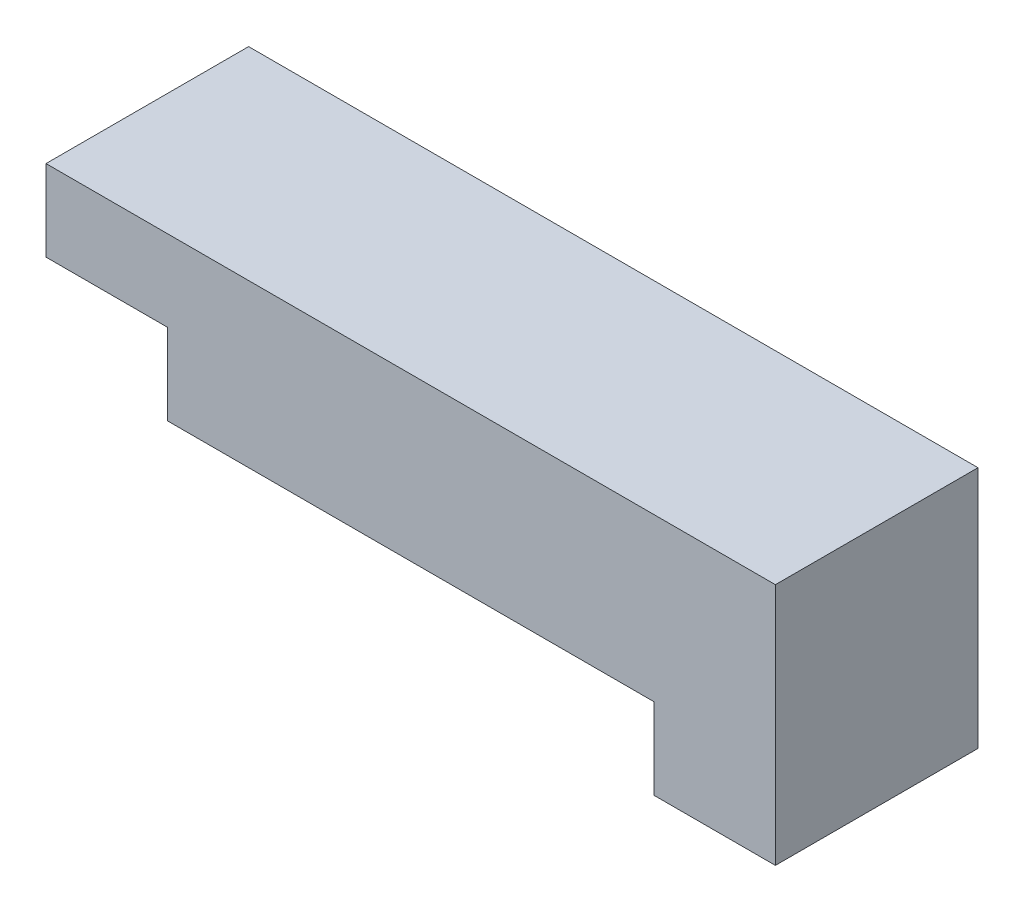
ISO-10303-21;
HEADER;
FILE_DESCRIPTION(('STEP AP214'),'2;1');
FILE_NAME('part.step','',(''),(''),'','','');
FILE_SCHEMA(('AUTOMOTIVE_DESIGN { 1 0 10303 214 1 1 1 1 }'));
ENDSEC;
DATA;
#1=APPLICATION_CONTEXT('core data for automotive mechanical design processes');
#2=APPLICATION_PROTOCOL_DEFINITION('international standard','automotive_design',2000,#1);
#3=PRODUCT_CONTEXT('',#1,'mechanical');
#4=PRODUCT('Part','Part','',(#3));
#5=PRODUCT_RELATED_PRODUCT_CATEGORY('part','',(#4));
#6=PRODUCT_DEFINITION_FORMATION('','',#4);
#7=PRODUCT_DEFINITION_CONTEXT('part definition',#1,'design');
#8=PRODUCT_DEFINITION('design','',#6,#7);
#9=PRODUCT_DEFINITION_SHAPE('','',#8);
#10=(LENGTH_UNIT() NAMED_UNIT(*) SI_UNIT(.MILLI.,.METRE.));
#11=(NAMED_UNIT(*) PLANE_ANGLE_UNIT() SI_UNIT($,.RADIAN.));
#12=(NAMED_UNIT(*) SI_UNIT($,.STERADIAN.) SOLID_ANGLE_UNIT());
#13=UNCERTAINTY_MEASURE_WITH_UNIT(LENGTH_MEASURE(1.E-05),#10,'distance_accuracy_value','');
#14=(GEOMETRIC_REPRESENTATION_CONTEXT(3) GLOBAL_UNCERTAINTY_ASSIGNED_CONTEXT((#13)) GLOBAL_UNIT_ASSIGNED_CONTEXT((#10,
#11,#12)) REPRESENTATION_CONTEXT('',''));
#15=CARTESIAN_POINT('',(0.,0.,0.));
#16=DIRECTION('',(0.,0.,1.));
#17=DIRECTION('',(1.,0.,0.));
#18=AXIS2_PLACEMENT_3D('',#15,#16,#17);
#19=CARTESIAN_POINT('',(-9.,6.,2.5));
#20=DIRECTION('',(0.,0.,-1.));
#21=DIRECTION('',(-1.,0.,0.));
#22=AXIS2_PLACEMENT_3D('',#19,#20,#21);
#23=PLANE('',#22);
#24=DIRECTION('',(0.,1.,0.));
#25=VECTOR('',#24,1.);
#26=CARTESIAN_POINT('',(-6.,4.,2.5));
#27=LINE('',#26,#25);
#28=CARTESIAN_POINT('',(-6.,2.,2.5));
#29=VERTEX_POINT('',#28);
#30=CARTESIAN_POINT('',(-6.,4.,2.5));
#31=VERTEX_POINT('',#30);
#32=EDGE_CURVE('E126',#29,#31,#27,.T.);
#33=ORIENTED_EDGE('',*,*,#32,.F.);
#34=DIRECTION('',(-1.,0.,0.));
#35=VECTOR('',#34,1.);
#36=CARTESIAN_POINT('',(14.6568542494924,2.,2.5));
#37=LINE('',#36,#35);
#38=CARTESIAN_POINT('',(6.,2.,2.5));
#39=VERTEX_POINT('',#38);
#40=EDGE_CURVE('E140',#39,#29,#37,.T.);
#41=ORIENTED_EDGE('',*,*,#40,.F.);
#42=DIRECTION('',(0.,1.,0.));
#43=VECTOR('',#42,1.);
#44=CARTESIAN_POINT('',(6.,2.,2.5));
#45=LINE('',#44,#43);
#46=CARTESIAN_POINT('',(6.,0.,2.5));
#47=VERTEX_POINT('',#46);
#48=EDGE_CURVE('E165',#47,#39,#45,.T.);
#49=ORIENTED_EDGE('',*,*,#48,.F.);
#50=DIRECTION('',(1.,0.,0.));
#51=VECTOR('',#50,1.);
#52=CARTESIAN_POINT('',(-9.,0.,2.5));
#53=LINE('',#52,#51);
#54=CARTESIAN_POINT('',(9.,0.,2.5));
#55=VERTEX_POINT('',#54);
#56=EDGE_CURVE('E83',#47,#55,#53,.T.);
#57=ORIENTED_EDGE('',*,*,#56,.T.);
#58=DIRECTION('',(0.,-1.,0.));
#59=VECTOR('',#58,1.);
#60=CARTESIAN_POINT('',(9.,6.,2.5));
#61=LINE('',#60,#59);
#62=CARTESIAN_POINT('',(9.,6.,2.5));
#63=VERTEX_POINT('',#62);
#64=EDGE_CURVE('E166',#63,#55,#61,.T.);
#65=ORIENTED_EDGE('',*,*,#64,.F.);
#66=DIRECTION('',(1.,0.,0.));
#67=VECTOR('',#66,1.);
#68=CARTESIAN_POINT('',(-9.,6.,2.5));
#69=LINE('',#68,#67);
#70=CARTESIAN_POINT('',(-9.,6.,2.5));
#71=VERTEX_POINT('',#70);
#72=EDGE_CURVE('E61',#71,#63,#69,.T.);
#73=ORIENTED_EDGE('',*,*,#72,.F.);
#74=DIRECTION('',(0.,-1.,0.));
#75=VECTOR('',#74,1.);
#76=CARTESIAN_POINT('',(-9.,6.,2.5));
#77=LINE('',#76,#75);
#78=CARTESIAN_POINT('',(-9.,4.,2.5));
#79=VERTEX_POINT('',#78);
#80=EDGE_CURVE('E182',#71,#79,#77,.T.);
#81=ORIENTED_EDGE('',*,*,#80,.T.);
#82=DIRECTION('',(-1.,0.,0.));
#83=VECTOR('',#82,1.);
#84=CARTESIAN_POINT('',(-9.,4.,2.5));
#85=LINE('',#84,#83);
#86=EDGE_CURVE('E139',#31,#79,#85,.T.);
#87=ORIENTED_EDGE('',*,*,#86,.F.);
#88=EDGE_LOOP('',(#33,#41,#49,#57,#65,#73,#81,#87));
#89=FACE_BOUND('',#88,.T.);
#90=ADVANCED_FACE('F41',(#89),#23,.F.);
#91=CARTESIAN_POINT('',(14.6568542494924,4.,0.600000000000001));
#92=DIRECTION('',(0.,0.,-1.));
#93=DIRECTION('',(0.,1.,0.));
#94=AXIS2_PLACEMENT_3D('',#91,#92,#93);
#95=PLANE('',#94);
#96=DIRECTION('',(-1.,0.,0.));
#97=VECTOR('',#96,1.);
#98=CARTESIAN_POINT('',(14.6568542494924,2.,0.600000000000001));
#99=LINE('',#98,#97);
#100=CARTESIAN_POINT('',(6.,2.,0.600000000000001));
#101=VERTEX_POINT('',#100);
#102=CARTESIAN_POINT('',(-5.99999999999999,2.,0.600000000000001));
#103=VERTEX_POINT('',#102);
#104=EDGE_CURVE('E148',#101,#103,#99,.T.);
#105=ORIENTED_EDGE('',*,*,#104,.T.);
#106=DIRECTION('',(0.,1.,0.));
#107=VECTOR('',#106,1.);
#108=CARTESIAN_POINT('',(-6.,4.,0.600000000000001));
#109=LINE('',#108,#107);
#110=CARTESIAN_POINT('',(-5.99999999999999,4.,0.600000000000001));
#111=VERTEX_POINT('',#110);
#112=EDGE_CURVE('E128',#103,#111,#109,.T.);
#113=ORIENTED_EDGE('',*,*,#112,.T.);
#114=DIRECTION('',(-1.,0.,0.));
#115=VECTOR('',#114,1.);
#116=CARTESIAN_POINT('',(14.6568542494924,4.,0.600000000000001));
#117=LINE('',#116,#115);
#118=CARTESIAN_POINT('',(6.,4.,0.600000000000001));
#119=VERTEX_POINT('',#118);
#120=EDGE_CURVE('E149',#119,#111,#117,.T.);
#121=ORIENTED_EDGE('',*,*,#120,.F.);
#122=DIRECTION('',(0.,1.,0.));
#123=VECTOR('',#122,1.);
#124=CARTESIAN_POINT('',(6.,4.,0.600000000000001));
#125=LINE('',#124,#123);
#126=EDGE_CURVE('E206',#101,#119,#125,.T.);
#127=ORIENTED_EDGE('',*,*,#126,.F.);
#128=EDGE_LOOP('',(#105,#113,#121,#127));
#129=FACE_BOUND('',#128,.T.);
#130=ADVANCED_FACE('F212',(#129),#95,.T.);
#131=CARTESIAN_POINT('',(0.,0.,0.));
#132=DIRECTION('',(0.,-1.,0.));
#133=DIRECTION('',(0.,0.,-1.));
#134=AXIS2_PLACEMENT_3D('',#131,#132,#133);
#135=PLANE('',#134);
#136=DIRECTION('',(0.,0.,1.));
#137=VECTOR('',#136,1.);
#138=CARTESIAN_POINT('',(6.,0.,2.5));
#139=LINE('',#138,#137);
#140=CARTESIAN_POINT('',(6.,0.,-1.5));
#141=VERTEX_POINT('',#140);
#142=EDGE_CURVE('E159',#141,#47,#139,.T.);
#143=ORIENTED_EDGE('',*,*,#142,.F.);
#144=DIRECTION('',(-1.,0.,0.));
#145=VECTOR('',#144,1.);
#146=CARTESIAN_POINT('',(14.6568542494924,0.,-1.5));
#147=LINE('',#146,#145);
#148=CARTESIAN_POINT('',(-9.,0.,-1.5));
#149=VERTEX_POINT('',#148);
#150=EDGE_CURVE('E150',#141,#149,#147,.T.);
#151=ORIENTED_EDGE('',*,*,#150,.T.);
#152=DIRECTION('',(0.,0.,1.));
#153=VECTOR('',#152,1.);
#154=CARTESIAN_POINT('',(-9.,0.,2.5));
#155=LINE('',#154,#153);
#156=CARTESIAN_POINT('',(-9.,0.,-2.5));
#157=VERTEX_POINT('',#156);
#158=EDGE_CURVE('E176',#157,#149,#155,.T.);
#159=ORIENTED_EDGE('',*,*,#158,.F.);
#160=DIRECTION('',(-1.,0.,0.));
#161=VECTOR('',#160,1.);
#162=CARTESIAN_POINT('',(-9.,0.,-2.5));
#163=LINE('',#162,#161);
#164=CARTESIAN_POINT('',(9.,0.,-2.5));
#165=VERTEX_POINT('',#164);
#166=EDGE_CURVE('E173',#165,#157,#163,.T.);
#167=ORIENTED_EDGE('',*,*,#166,.F.);
#168=DIRECTION('',(0.,0.,-1.));
#169=VECTOR('',#168,1.);
#170=CARTESIAN_POINT('',(9.,0.,2.5));
#171=LINE('',#170,#169);
#172=EDGE_CURVE('E168',#55,#165,#171,.T.);
#173=ORIENTED_EDGE('',*,*,#172,.F.);
#174=ORIENTED_EDGE('',*,*,#56,.F.);
#175=EDGE_LOOP('',(#143,#151,#159,#167,#173,#174));
#176=FACE_BOUND('',#175,.T.);
#177=ADVANCED_FACE('F191',(#176),#135,.T.);
#178=CARTESIAN_POINT('',(9.,6.,2.5));
#179=DIRECTION('',(-1.,0.,0.));
#180=DIRECTION('',(0.,0.,1.));
#181=AXIS2_PLACEMENT_3D('',#178,#179,#180);
#182=PLANE('',#181);
#183=ORIENTED_EDGE('',*,*,#172,.T.);
#184=DIRECTION('',(0.,-1.,0.));
#185=VECTOR('',#184,1.);
#186=CARTESIAN_POINT('',(9.,6.,-2.5));
#187=LINE('',#186,#185);
#188=CARTESIAN_POINT('',(9.,6.,-2.5));
#189=VERTEX_POINT('',#188);
#190=EDGE_CURVE('E12',#189,#165,#187,.T.);
#191=ORIENTED_EDGE('',*,*,#190,.F.);
#192=DIRECTION('',(0.,0.,-1.));
#193=VECTOR('',#192,1.);
#194=CARTESIAN_POINT('',(9.,6.,2.5));
#195=LINE('',#194,#193);
#196=EDGE_CURVE('E162',#63,#189,#195,.T.);
#197=ORIENTED_EDGE('',*,*,#196,.F.);
#198=ORIENTED_EDGE('',*,*,#64,.T.);
#199=EDGE_LOOP('',(#183,#191,#197,#198));
#200=FACE_BOUND('',#199,.T.);
#201=ADVANCED_FACE('F43',(#200),#182,.F.);
#202=CARTESIAN_POINT('',(-9.,6.,-2.5));
#203=DIRECTION('',(0.,0.,1.));
#204=DIRECTION('',(1.,0.,0.));
#205=AXIS2_PLACEMENT_3D('',#202,#203,#204);
#206=PLANE('',#205);
#207=ORIENTED_EDGE('',*,*,#166,.T.);
#208=DIRECTION('',(0.,-1.,0.));
#209=VECTOR('',#208,1.);
#210=CARTESIAN_POINT('',(-9.,6.,-2.5));
#211=LINE('',#210,#209);
#212=CARTESIAN_POINT('',(-9.,6.,-2.5));
#213=VERTEX_POINT('',#212);
#214=EDGE_CURVE('E47',#213,#157,#211,.T.);
#215=ORIENTED_EDGE('',*,*,#214,.F.);
#216=DIRECTION('',(-1.,0.,0.));
#217=VECTOR('',#216,1.);
#218=CARTESIAN_POINT('',(-9.,6.,-2.5));
#219=LINE('',#218,#217);
#220=EDGE_CURVE('E89',#189,#213,#219,.T.);
#221=ORIENTED_EDGE('',*,*,#220,.F.);
#222=ORIENTED_EDGE('',*,*,#190,.T.);
#223=EDGE_LOOP('',(#207,#215,#221,#222));
#224=FACE_BOUND('',#223,.T.);
#225=ADVANCED_FACE('F235',(#224),#206,.F.);
#226=CARTESIAN_POINT('',(-9.,6.,2.5));
#227=DIRECTION('',(1.,0.,0.));
#228=DIRECTION('',(0.,0.,-1.));
#229=AXIS2_PLACEMENT_3D('',#226,#227,#228);
#230=PLANE('',#229);
#231=DIRECTION('',(0.,0.,1.));
#232=VECTOR('',#231,1.);
#233=CARTESIAN_POINT('',(-9.,4.,0.600000000000001));
#234=LINE('',#233,#232);
#235=CARTESIAN_POINT('',(-9.,4.,-1.5));
#236=VERTEX_POINT('',#235);
#237=EDGE_CURVE('E155',#236,#79,#234,.T.);
#238=ORIENTED_EDGE('',*,*,#237,.T.);
#239=ORIENTED_EDGE('',*,*,#80,.F.);
#240=DIRECTION('',(0.,0.,1.));
#241=VECTOR('',#240,1.);
#242=CARTESIAN_POINT('',(-9.,6.,2.5));
#243=LINE('',#242,#241);
#244=EDGE_CURVE('E167',#213,#71,#243,.T.);
#245=ORIENTED_EDGE('',*,*,#244,.F.);
#246=ORIENTED_EDGE('',*,*,#214,.T.);
#247=ORIENTED_EDGE('',*,*,#158,.T.);
#248=DIRECTION('',(0.,1.,0.));
#249=VECTOR('',#248,1.);
#250=CARTESIAN_POINT('',(-9.,0.,-1.5));
#251=LINE('',#250,#249);
#252=EDGE_CURVE('E197',#149,#236,#251,.T.);
#253=ORIENTED_EDGE('',*,*,#252,.T.);
#254=EDGE_LOOP('',(#238,#239,#245,#246,#247,#253));
#255=FACE_BOUND('',#254,.T.);
#256=ADVANCED_FACE('F187',(#255),#230,.F.);
#257=CARTESIAN_POINT('',(0.,6.,0.));
#258=DIRECTION('',(0.,-1.,0.));
#259=DIRECTION('',(0.,0.,-1.));
#260=AXIS2_PLACEMENT_3D('',#257,#258,#259);
#261=PLANE('',#260);
#262=ORIENTED_EDGE('',*,*,#196,.T.);
#263=ORIENTED_EDGE('',*,*,#220,.T.);
#264=ORIENTED_EDGE('',*,*,#244,.T.);
#265=ORIENTED_EDGE('',*,*,#72,.T.);
#266=EDGE_LOOP('',(#262,#263,#264,#265));
#267=FACE_BOUND('',#266,.T.);
#268=ADVANCED_FACE('F225',(#267),#261,.F.);
#269=CARTESIAN_POINT('',(14.6568542494924,2.,0.600000000000001));
#270=DIRECTION('',(0.,-1.,0.));
#271=DIRECTION('',(0.,0.,-1.));
#272=AXIS2_PLACEMENT_3D('',#269,#270,#271);
#273=PLANE('',#272);
#274=DIRECTION('',(0.,0.,1.));
#275=VECTOR('',#274,1.);
#276=CARTESIAN_POINT('',(-6.,2.,-2.501));
#277=LINE('',#276,#275);
#278=EDGE_CURVE('E124',#103,#29,#277,.T.);
#279=ORIENTED_EDGE('',*,*,#278,.F.);
#280=ORIENTED_EDGE('',*,*,#104,.F.);
#281=DIRECTION('',(0.,0.,-1.));
#282=VECTOR('',#281,1.);
#283=CARTESIAN_POINT('',(6.,2.,0.600000000000001));
#284=LINE('',#283,#282);
#285=EDGE_CURVE('E145',#39,#101,#284,.T.);
#286=ORIENTED_EDGE('',*,*,#285,.F.);
#287=ORIENTED_EDGE('',*,*,#40,.T.);
#288=EDGE_LOOP('',(#279,#280,#286,#287));
#289=FACE_BOUND('',#288,.T.);
#290=ADVANCED_FACE('F142',(#289),#273,.T.);
#291=CARTESIAN_POINT('',(14.6568542494924,4.,0.600000000000001));
#292=DIRECTION('',(0.,-1.,0.));
#293=DIRECTION('',(0.,0.,-1.));
#294=AXIS2_PLACEMENT_3D('',#291,#292,#293);
#295=PLANE('',#294);
#296=ORIENTED_EDGE('',*,*,#120,.T.);
#297=DIRECTION('',(0.,0.,1.));
#298=VECTOR('',#297,1.);
#299=CARTESIAN_POINT('',(-6.,4.,-2.501));
#300=LINE('',#299,#298);
#301=EDGE_CURVE('E57',#111,#31,#300,.T.);
#302=ORIENTED_EDGE('',*,*,#301,.T.);
#303=ORIENTED_EDGE('',*,*,#86,.T.);
#304=ORIENTED_EDGE('',*,*,#237,.F.);
#305=DIRECTION('',(-1.,0.,0.));
#306=VECTOR('',#305,1.);
#307=CARTESIAN_POINT('',(14.6568542494924,4.,-1.5));
#308=LINE('',#307,#306);
#309=CARTESIAN_POINT('',(6.,4.,-1.5));
#310=VERTEX_POINT('',#309);
#311=EDGE_CURVE('E158',#310,#236,#308,.T.);
#312=ORIENTED_EDGE('',*,*,#311,.F.);
#313=DIRECTION('',(0.,0.,-1.));
#314=VECTOR('',#313,1.);
#315=CARTESIAN_POINT('',(6.,4.,0.600000000000001));
#316=LINE('',#315,#314);
#317=EDGE_CURVE('E201',#119,#310,#316,.T.);
#318=ORIENTED_EDGE('',*,*,#317,.F.);
#319=EDGE_LOOP('',(#296,#302,#303,#304,#312,#318));
#320=FACE_BOUND('',#319,.T.);
#321=ADVANCED_FACE('F216',(#320),#295,.T.);
#322=CARTESIAN_POINT('',(14.6568542494924,0.,-1.5));
#323=DIRECTION('',(0.,0.,1.));
#324=DIRECTION('',(1.,0.,0.));
#325=AXIS2_PLACEMENT_3D('',#322,#323,#324);
#326=PLANE('',#325);
#327=ORIENTED_EDGE('',*,*,#311,.T.);
#328=ORIENTED_EDGE('',*,*,#252,.F.);
#329=ORIENTED_EDGE('',*,*,#150,.F.);
#330=DIRECTION('',(0.,-1.,0.));
#331=VECTOR('',#330,1.);
#332=CARTESIAN_POINT('',(6.,0.,-1.5));
#333=LINE('',#332,#331);
#334=EDGE_CURVE('E174',#310,#141,#333,.T.);
#335=ORIENTED_EDGE('',*,*,#334,.F.);
#336=EDGE_LOOP('',(#327,#328,#329,#335));
#337=FACE_BOUND('',#336,.T.);
#338=ADVANCED_FACE('F194',(#337),#326,.T.);
#339=CARTESIAN_POINT('',(6.,6.,2.5));
#340=DIRECTION('',(-1.,0.,0.));
#341=DIRECTION('',(0.,0.,1.));
#342=AXIS2_PLACEMENT_3D('',#339,#340,#341);
#343=PLANE('',#342);
#344=ORIENTED_EDGE('',*,*,#317,.T.);
#345=ORIENTED_EDGE('',*,*,#334,.T.);
#346=ORIENTED_EDGE('',*,*,#142,.T.);
#347=ORIENTED_EDGE('',*,*,#48,.T.);
#348=ORIENTED_EDGE('',*,*,#285,.T.);
#349=ORIENTED_EDGE('',*,*,#126,.T.);
#350=EDGE_LOOP('',(#344,#345,#346,#347,#348,#349));
#351=FACE_BOUND('',#350,.T.);
#352=ADVANCED_FACE('F217',(#351),#343,.T.);
#353=CARTESIAN_POINT('',(-6.,4.,-2.501));
#354=DIRECTION('',(1.,0.,0.));
#355=DIRECTION('',(0.,0.,-1.));
#356=AXIS2_PLACEMENT_3D('',#353,#354,#355);
#357=PLANE('',#356);
#358=ORIENTED_EDGE('',*,*,#278,.T.);
#359=ORIENTED_EDGE('',*,*,#32,.T.);
#360=ORIENTED_EDGE('',*,*,#301,.F.);
#361=ORIENTED_EDGE('',*,*,#112,.F.);
#362=EDGE_LOOP('',(#358,#359,#360,#361));
#363=FACE_BOUND('',#362,.T.);
#364=ADVANCED_FACE('F130',(#363),#357,.F.);
#365=CLOSED_SHELL('',(#90,#130,#177,#201,#225,#256,#268,#290,#321,#338,#352,#364));
#366=MANIFOLD_SOLID_BREP('B2',#365);
#367=ADVANCED_BREP_SHAPE_REPRESENTATION('',(#18,#366),#14);
#368=SHAPE_DEFINITION_REPRESENTATION(#9,#367);
ENDSEC;
END-ISO-10303-21;
